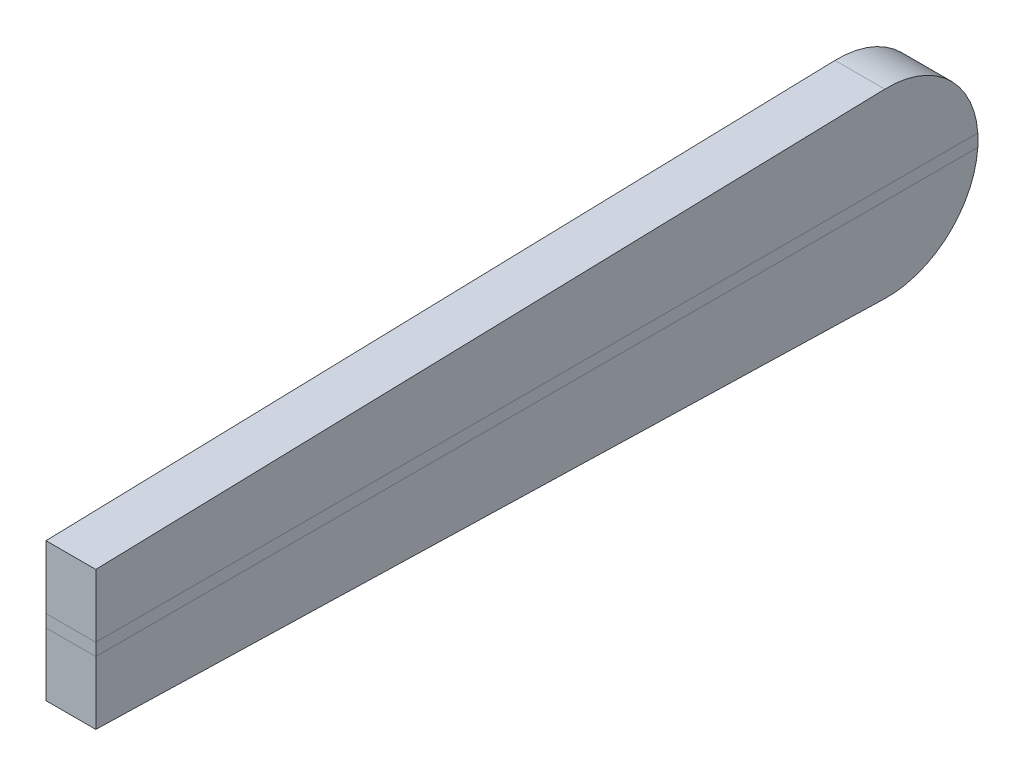
ISO-10303-21;
HEADER;
FILE_DESCRIPTION(('STEP AP214'),'2;1');
FILE_NAME('part.step','',(''),(''),'','','');
FILE_SCHEMA(('AUTOMOTIVE_DESIGN { 1 0 10303 214 1 1 1 1 }'));
ENDSEC;
DATA;
#1=APPLICATION_CONTEXT('core data for automotive mechanical design processes');
#2=APPLICATION_PROTOCOL_DEFINITION('international standard','automotive_design',2000,#1);
#3=PRODUCT_CONTEXT('',#1,'mechanical');
#4=PRODUCT('Part','Part','',(#3));
#5=PRODUCT_RELATED_PRODUCT_CATEGORY('part','',(#4));
#6=PRODUCT_DEFINITION_FORMATION('','',#4);
#7=PRODUCT_DEFINITION_CONTEXT('part definition',#1,'design');
#8=PRODUCT_DEFINITION('design','',#6,#7);
#9=PRODUCT_DEFINITION_SHAPE('','',#8);
#10=(LENGTH_UNIT() NAMED_UNIT(*) SI_UNIT(.MILLI.,.METRE.));
#11=(NAMED_UNIT(*) PLANE_ANGLE_UNIT() SI_UNIT($,.RADIAN.));
#12=(NAMED_UNIT(*) SI_UNIT($,.STERADIAN.) SOLID_ANGLE_UNIT());
#13=UNCERTAINTY_MEASURE_WITH_UNIT(LENGTH_MEASURE(1.E-05),#10,'distance_accuracy_value','');
#14=(GEOMETRIC_REPRESENTATION_CONTEXT(3) GLOBAL_UNCERTAINTY_ASSIGNED_CONTEXT((#13)) GLOBAL_UNIT_ASSIGNED_CONTEXT((#10,
#11,#12)) REPRESENTATION_CONTEXT('',''));
#15=CARTESIAN_POINT('',(0.,0.,0.));
#16=DIRECTION('',(0.,0.,1.));
#17=DIRECTION('',(1.,0.,0.));
#18=AXIS2_PLACEMENT_3D('',#15,#16,#17);
#19=CARTESIAN_POINT('',(11.22,0.,-78.96));
#20=DIRECTION('',(-1.,0.,0.));
#21=DIRECTION('',(0.,0.,1.));
#22=AXIS2_PLACEMENT_3D('',#19,#20,#21);
#23=CYLINDRICAL_SURFACE('',#22,20.455);
#24=DIRECTION('',(-1.,0.,0.));
#25=VECTOR('',#24,1.);
#26=CARTESIAN_POINT('',(11.22,1.4,-99.3670337138939));
#27=LINE('',#26,#25);
#28=CARTESIAN_POINT('',(11.22,1.4,-99.3670337138939));
#29=VERTEX_POINT('',#28);
#30=CARTESIAN_POINT('',(0.,1.4,-99.3670337138939));
#31=VERTEX_POINT('',#30);
#32=EDGE_CURVE('E11',#29,#31,#27,.T.);
#33=ORIENTED_EDGE('',*,*,#32,.F.);
#34=CARTESIAN_POINT('',(11.22,0.,-78.96));
#35=DIRECTION('',(1.,0.,0.));
#36=DIRECTION('',(0.,0.,-1.));
#37=AXIS2_PLACEMENT_3D('',#34,#35,#36);
#38=CIRCLE('',#37,20.455);
#39=CARTESIAN_POINT('',(11.22,-1.4,-99.3670337138939));
#40=VERTEX_POINT('',#39);
#41=EDGE_CURVE('E122',#40,#29,#38,.T.);
#42=ORIENTED_EDGE('',*,*,#41,.F.);
#43=DIRECTION('',(-1.,0.,0.));
#44=VECTOR('',#43,1.);
#45=CARTESIAN_POINT('',(11.22,-1.4,-99.3670337138939));
#46=LINE('',#45,#44);
#47=CARTESIAN_POINT('',(0.,-1.4,-99.3670337138939));
#48=VERTEX_POINT('',#47);
#49=EDGE_CURVE('E117',#40,#48,#46,.T.);
#50=ORIENTED_EDGE('',*,*,#49,.T.);
#51=CARTESIAN_POINT('',(0.,0.,-78.96));
#52=DIRECTION('',(1.,0.,0.));
#53=DIRECTION('',(0.,0.,-1.));
#54=AXIS2_PLACEMENT_3D('',#51,#52,#53);
#55=CIRCLE('',#54,20.455);
#56=EDGE_CURVE('E193',#48,#31,#55,.T.);
#57=ORIENTED_EDGE('',*,*,#56,.T.);
#58=EDGE_LOOP('',(#33,#42,#50,#57));
#59=FACE_BOUND('',#58,.T.);
#60=ADVANCED_FACE('F45',(#59),#23,.T.);
#61=CARTESIAN_POINT('',(11.22,-15.615,99.415));
#62=DIRECTION('',(0.,0.,-1.));
#63=DIRECTION('',(-1.,0.,0.));
#64=AXIS2_PLACEMENT_3D('',#61,#62,#63);
#65=PLANE('',#64);
#66=DIRECTION('',(1.,0.,0.));
#67=VECTOR('',#66,1.);
#68=CARTESIAN_POINT('',(11.22,1.4,99.415));
#69=LINE('',#68,#67);
#70=CARTESIAN_POINT('',(0.,1.4,99.415));
#71=VERTEX_POINT('',#70);
#72=CARTESIAN_POINT('',(11.22,1.4,99.415));
#73=VERTEX_POINT('',#72);
#74=EDGE_CURVE('E49',#71,#73,#69,.T.);
#75=ORIENTED_EDGE('',*,*,#74,.F.);
#76=DIRECTION('',(0.,-1.,0.));
#77=VECTOR('',#76,1.);
#78=CARTESIAN_POINT('',(0.,-15.615,99.415));
#79=LINE('',#78,#77);
#80=CARTESIAN_POINT('',(0.,-1.4,99.415));
#81=VERTEX_POINT('',#80);
#82=EDGE_CURVE('E173',#71,#81,#79,.T.);
#83=ORIENTED_EDGE('',*,*,#82,.T.);
#84=DIRECTION('',(1.,0.,0.));
#85=VECTOR('',#84,1.);
#86=CARTESIAN_POINT('',(11.22,-1.4,99.415));
#87=LINE('',#86,#85);
#88=CARTESIAN_POINT('',(11.22,-1.4,99.415));
#89=VERTEX_POINT('',#88);
#90=EDGE_CURVE('E155',#81,#89,#87,.T.);
#91=ORIENTED_EDGE('',*,*,#90,.T.);
#92=DIRECTION('',(0.,-1.,0.));
#93=VECTOR('',#92,1.);
#94=CARTESIAN_POINT('',(11.22,-15.615,99.415));
#95=LINE('',#94,#93);
#96=EDGE_CURVE('E170',#73,#89,#95,.T.);
#97=ORIENTED_EDGE('',*,*,#96,.F.);
#98=EDGE_LOOP('',(#75,#83,#91,#97));
#99=FACE_BOUND('',#98,.T.);
#100=ADVANCED_FACE('F169',(#99),#65,.F.);
#101=ORIENTED_EDGE('',*,*,#49,.F.);
#102=CARTESIAN_POINT('',(11.22,-20.4474507118167,-78.4043162879609));
#103=VERTEX_POINT('',#102);
#104=EDGE_CURVE('E110',#103,#40,#38,.T.);
#105=ORIENTED_EDGE('',*,*,#104,.F.);
#106=DIRECTION('',(-1.,0.,0.));
#107=VECTOR('',#106,1.);
#108=CARTESIAN_POINT('',(11.22,-20.4474507118167,-78.4043162879609));
#109=LINE('',#108,#107);
#110=CARTESIAN_POINT('',(0.,-20.4474507118167,-78.4043162879609));
#111=VERTEX_POINT('',#110);
#112=EDGE_CURVE('E115',#103,#111,#109,.T.);
#113=ORIENTED_EDGE('',*,*,#112,.T.);
#114=EDGE_CURVE('E192',#111,#48,#55,.T.);
#115=ORIENTED_EDGE('',*,*,#114,.T.);
#116=EDGE_LOOP('',(#101,#105,#113,#115));
#117=FACE_BOUND('',#116,.T.);
#118=ADVANCED_FACE('F112',(#117),#23,.T.);
#119=ORIENTED_EDGE('',*,*,#90,.F.);
#120=CARTESIAN_POINT('',(0.,-15.615,99.415));
#121=VERTEX_POINT('',#120);
#122=EDGE_CURVE('E189',#81,#121,#79,.T.);
#123=ORIENTED_EDGE('',*,*,#122,.T.);
#124=DIRECTION('',(-1.,0.,0.));
#125=VECTOR('',#124,1.);
#126=CARTESIAN_POINT('',(11.22,-15.615,99.415));
#127=LINE('',#126,#125);
#128=CARTESIAN_POINT('',(11.22,-15.615,99.415));
#129=VERTEX_POINT('',#128);
#130=EDGE_CURVE('E181',#129,#121,#127,.T.);
#131=ORIENTED_EDGE('',*,*,#130,.F.);
#132=EDGE_CURVE('E129',#89,#129,#95,.T.);
#133=ORIENTED_EDGE('',*,*,#132,.F.);
#134=EDGE_LOOP('',(#119,#123,#131,#133));
#135=FACE_BOUND('',#134,.T.);
#136=ADVANCED_FACE('F180',(#135),#65,.F.);
#137=CARTESIAN_POINT('',(11.22,0.,-78.96));
#138=DIRECTION('',(1.,0.,0.));
#139=DIRECTION('',(0.,0.,-1.));
#140=AXIS2_PLACEMENT_3D('',#137,#138,#139);
#141=PLANE('',#140);
#142=ORIENTED_EDGE('',*,*,#41,.T.);
#143=DIRECTION('',(0.,0.,1.));
#144=VECTOR('',#143,1.);
#145=CARTESIAN_POINT('',(11.22,1.4,-78.96));
#146=LINE('',#145,#144);
#147=EDGE_CURVE('E152',#29,#73,#146,.T.);
#148=ORIENTED_EDGE('',*,*,#147,.T.);
#149=ORIENTED_EDGE('',*,*,#96,.T.);
#150=DIRECTION('',(0.,0.,1.));
#151=VECTOR('',#150,1.);
#152=CARTESIAN_POINT('',(11.22,-1.4,-78.96));
#153=LINE('',#152,#151);
#154=EDGE_CURVE('E137',#40,#89,#153,.T.);
#155=ORIENTED_EDGE('',*,*,#154,.F.);
#156=EDGE_LOOP('',(#142,#148,#149,#155));
#157=FACE_BOUND('',#156,.T.);
#158=ADVANCED_FACE('F177',(#157),#141,.T.);
#159=CARTESIAN_POINT('',(0.,0.,-78.96));
#160=DIRECTION('',(1.,0.,0.));
#161=DIRECTION('',(0.,0.,-1.));
#162=AXIS2_PLACEMENT_3D('',#159,#160,#161);
#163=PLANE('',#162);
#164=DIRECTION('',(0.,0.,1.));
#165=VECTOR('',#164,1.);
#166=CARTESIAN_POINT('',(0.,1.4,-78.96));
#167=LINE('',#166,#165);
#168=EDGE_CURVE('E150',#31,#71,#167,.T.);
#169=ORIENTED_EDGE('',*,*,#168,.F.);
#170=ORIENTED_EDGE('',*,*,#56,.F.);
#171=DIRECTION('',(0.,0.,1.));
#172=VECTOR('',#171,1.);
#173=CARTESIAN_POINT('',(0.,-1.4,-78.96));
#174=LINE('',#173,#172);
#175=EDGE_CURVE('E141',#48,#81,#174,.T.);
#176=ORIENTED_EDGE('',*,*,#175,.T.);
#177=ORIENTED_EDGE('',*,*,#82,.F.);
#178=EDGE_LOOP('',(#169,#170,#176,#177));
#179=FACE_BOUND('',#178,.T.);
#180=ADVANCED_FACE('F202',(#179),#163,.F.);
#181=ORIENTED_EDGE('',*,*,#175,.F.);
#182=ORIENTED_EDGE('',*,*,#114,.F.);
#183=DIRECTION('',(0.,-0.0271661555629011,-0.999630931890331));
#184=VECTOR('',#183,1.);
#185=CARTESIAN_POINT('',(0.,-20.4474507118167,-78.4043162879609));
#186=LINE('',#185,#184);
#187=EDGE_CURVE('E136',#121,#111,#186,.T.);
#188=ORIENTED_EDGE('',*,*,#187,.F.);
#189=ORIENTED_EDGE('',*,*,#122,.F.);
#190=EDGE_LOOP('',(#181,#182,#188,#189));
#191=FACE_BOUND('',#190,.T.);
#192=ADVANCED_FACE('F205',(#191),#163,.F.);
#193=ORIENTED_EDGE('',*,*,#104,.T.);
#194=ORIENTED_EDGE('',*,*,#154,.T.);
#195=ORIENTED_EDGE('',*,*,#132,.T.);
#196=DIRECTION('',(0.,-0.0271661555629011,-0.999630931890331));
#197=VECTOR('',#196,1.);
#198=CARTESIAN_POINT('',(11.22,-20.4474507118167,-78.4043162879609));
#199=LINE('',#198,#197);
#200=EDGE_CURVE('E126',#129,#103,#199,.T.);
#201=ORIENTED_EDGE('',*,*,#200,.T.);
#202=EDGE_LOOP('',(#193,#194,#195,#201));
#203=FACE_BOUND('',#202,.T.);
#204=ADVANCED_FACE('F127',(#203),#141,.T.);
#205=CARTESIAN_POINT('',(11.22,-20.4474507118167,-78.4043162879609));
#206=DIRECTION('',(0.,0.999630931890331,-0.0271661555629011));
#207=DIRECTION('',(0.,0.0271661555629011,0.999630931890331));
#208=AXIS2_PLACEMENT_3D('',#205,#206,#207);
#209=PLANE('',#208);
#210=ORIENTED_EDGE('',*,*,#187,.T.);
#211=ORIENTED_EDGE('',*,*,#112,.F.);
#212=ORIENTED_EDGE('',*,*,#200,.F.);
#213=ORIENTED_EDGE('',*,*,#130,.T.);
#214=EDGE_LOOP('',(#210,#211,#212,#213));
#215=FACE_BOUND('',#214,.T.);
#216=ADVANCED_FACE('F47',(#215),#209,.F.);
#217=CARTESIAN_POINT('',(11.22,20.4474507118167,-78.4043162879609));
#218=VERTEX_POINT('',#217);
#219=EDGE_CURVE('E124',#29,#218,#38,.T.);
#220=ORIENTED_EDGE('',*,*,#219,.F.);
#221=ORIENTED_EDGE('',*,*,#32,.T.);
#222=CARTESIAN_POINT('',(0.,20.4474507118167,-78.4043162879609));
#223=VERTEX_POINT('',#222);
#224=EDGE_CURVE('E194',#31,#223,#55,.T.);
#225=ORIENTED_EDGE('',*,*,#224,.T.);
#226=DIRECTION('',(-1.,0.,0.));
#227=VECTOR('',#226,1.);
#228=CARTESIAN_POINT('',(11.22,20.4474507118167,-78.4043162879609));
#229=LINE('',#228,#227);
#230=EDGE_CURVE('E138',#218,#223,#229,.T.);
#231=ORIENTED_EDGE('',*,*,#230,.F.);
#232=EDGE_LOOP('',(#220,#221,#225,#231));
#233=FACE_BOUND('',#232,.T.);
#234=ADVANCED_FACE('F219',(#233),#23,.T.);
#235=CARTESIAN_POINT('',(11.22,15.615,99.415));
#236=DIRECTION('',(0.,-0.999630931890331,-0.0271661555629011));
#237=DIRECTION('',(0.,0.0271661555629011,-0.999630931890331));
#238=AXIS2_PLACEMENT_3D('',#235,#236,#237);
#239=PLANE('',#238);
#240=DIRECTION('',(0.,-0.0271661555629011,0.999630931890331));
#241=VECTOR('',#240,1.);
#242=CARTESIAN_POINT('',(0.,15.615,99.415));
#243=LINE('',#242,#241);
#244=CARTESIAN_POINT('',(0.,15.615,99.415));
#245=VERTEX_POINT('',#244);
#246=EDGE_CURVE('E190',#223,#245,#243,.T.);
#247=ORIENTED_EDGE('',*,*,#246,.T.);
#248=DIRECTION('',(-1.,0.,0.));
#249=VECTOR('',#248,1.);
#250=CARTESIAN_POINT('',(11.22,15.615,99.415));
#251=LINE('',#250,#249);
#252=CARTESIAN_POINT('',(11.22,15.615,99.415));
#253=VERTEX_POINT('',#252);
#254=EDGE_CURVE('E144',#253,#245,#251,.T.);
#255=ORIENTED_EDGE('',*,*,#254,.F.);
#256=DIRECTION('',(0.,-0.0271661555629011,0.999630931890331));
#257=VECTOR('',#256,1.);
#258=CARTESIAN_POINT('',(11.22,15.615,99.415));
#259=LINE('',#258,#257);
#260=EDGE_CURVE('E121',#218,#253,#259,.T.);
#261=ORIENTED_EDGE('',*,*,#260,.F.);
#262=ORIENTED_EDGE('',*,*,#230,.T.);
#263=EDGE_LOOP('',(#247,#255,#261,#262));
#264=FACE_BOUND('',#263,.T.);
#265=ADVANCED_FACE('F227',(#264),#239,.F.);
#266=EDGE_CURVE('E133',#245,#71,#79,.T.);
#267=ORIENTED_EDGE('',*,*,#266,.T.);
#268=ORIENTED_EDGE('',*,*,#74,.T.);
#269=EDGE_CURVE('E178',#253,#73,#95,.T.);
#270=ORIENTED_EDGE('',*,*,#269,.F.);
#271=ORIENTED_EDGE('',*,*,#254,.T.);
#272=EDGE_LOOP('',(#267,#268,#270,#271));
#273=FACE_BOUND('',#272,.T.);
#274=ADVANCED_FACE('F223',(#273),#65,.F.);
#275=ORIENTED_EDGE('',*,*,#147,.F.);
#276=ORIENTED_EDGE('',*,*,#219,.T.);
#277=ORIENTED_EDGE('',*,*,#260,.T.);
#278=ORIENTED_EDGE('',*,*,#269,.T.);
#279=EDGE_LOOP('',(#275,#276,#277,#278));
#280=FACE_BOUND('',#279,.T.);
#281=ADVANCED_FACE('F214',(#280),#141,.T.);
#282=ORIENTED_EDGE('',*,*,#224,.F.);
#283=ORIENTED_EDGE('',*,*,#168,.T.);
#284=ORIENTED_EDGE('',*,*,#266,.F.);
#285=ORIENTED_EDGE('',*,*,#246,.F.);
#286=EDGE_LOOP('',(#282,#283,#284,#285));
#287=FACE_BOUND('',#286,.T.);
#288=ADVANCED_FACE('F208',(#287),#163,.F.);
#289=CLOSED_SHELL('',(#60,#100,#118,#136,#158,#180,#192,#204,#216,#234,#265,#274,#281,#288));
#290=MANIFOLD_SOLID_BREP('B2',#289);
#291=ADVANCED_BREP_SHAPE_REPRESENTATION('',(#18,#290),#14);
#292=SHAPE_DEFINITION_REPRESENTATION(#9,#291);
ENDSEC;
END-ISO-10303-21;
